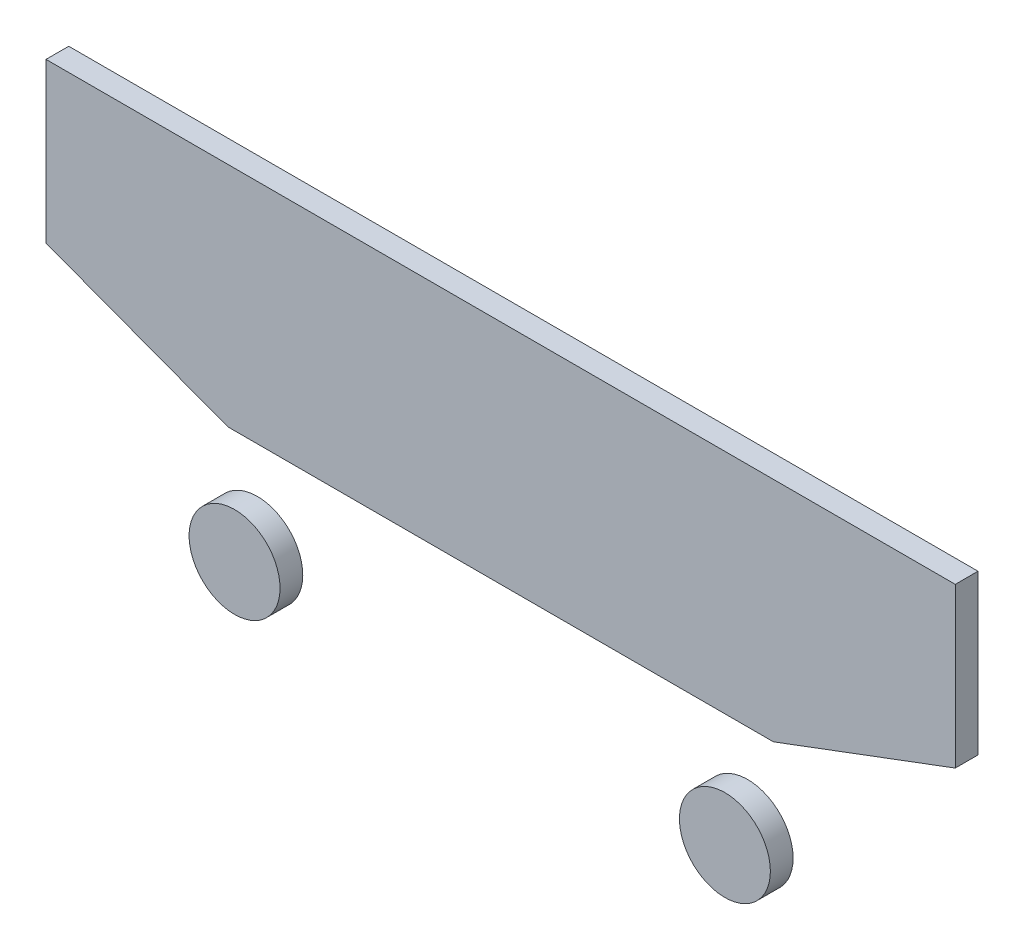
ISO-10303-21;
HEADER;
FILE_DESCRIPTION(('STEP AP214'),'2;1');
FILE_NAME('part.step','',(''),(''),'','','');
FILE_SCHEMA(('AUTOMOTIVE_DESIGN { 1 0 10303 214 1 1 1 1 }'));
ENDSEC;
DATA;
#1=APPLICATION_CONTEXT('core data for automotive mechanical design processes');
#2=APPLICATION_PROTOCOL_DEFINITION('international standard','automotive_design',2000,#1);
#3=PRODUCT_CONTEXT('',#1,'mechanical');
#4=PRODUCT('Part','Part','',(#3));
#5=PRODUCT_RELATED_PRODUCT_CATEGORY('part','',(#4));
#6=PRODUCT_DEFINITION_FORMATION('','',#4);
#7=PRODUCT_DEFINITION_CONTEXT('part definition',#1,'design');
#8=PRODUCT_DEFINITION('design','',#6,#7);
#9=PRODUCT_DEFINITION_SHAPE('','',#8);
#10=(LENGTH_UNIT() NAMED_UNIT(*) SI_UNIT(.MILLI.,.METRE.));
#11=(NAMED_UNIT(*) PLANE_ANGLE_UNIT() SI_UNIT($,.RADIAN.));
#12=(NAMED_UNIT(*) SI_UNIT($,.STERADIAN.) SOLID_ANGLE_UNIT());
#13=UNCERTAINTY_MEASURE_WITH_UNIT(LENGTH_MEASURE(1.E-05),#10,'distance_accuracy_value','');
#14=(GEOMETRIC_REPRESENTATION_CONTEXT(3) GLOBAL_UNCERTAINTY_ASSIGNED_CONTEXT((#13)) GLOBAL_UNIT_ASSIGNED_CONTEXT((#10,
#11,#12)) REPRESENTATION_CONTEXT('',''));
#15=CARTESIAN_POINT('',(0.,0.,0.));
#16=DIRECTION('',(0.,0.,1.));
#17=DIRECTION('',(1.,0.,0.));
#18=AXIS2_PLACEMENT_3D('',#15,#16,#17);
#19=CARTESIAN_POINT('',(107.850406647226,10.,5.));
#20=DIRECTION('',(0.,0.,-1.));
#21=DIRECTION('',(-1.,0.,0.));
#22=AXIS2_PLACEMENT_3D('',#19,#20,#21);
#23=CYLINDRICAL_SURFACE('',#22,9.99999999999998);
#24=CARTESIAN_POINT('',(107.850406647226,10.,5.));
#25=DIRECTION('',(0.,0.,1.));
#26=DIRECTION('',(1.,0.,0.));
#27=AXIS2_PLACEMENT_3D('',#24,#25,#26);
#28=CIRCLE('',#27,9.99999999999998);
#29=CARTESIAN_POINT('',(117.850406647226,10.,5.));
#30=VERTEX_POINT('',#29);
#31=EDGE_CURVE('E52',#30,#30,#28,.T.);
#32=ORIENTED_EDGE('',*,*,#31,.F.);
#33=EDGE_LOOP('',(#32));
#34=FACE_BOUND('',#33,.T.);
#35=CARTESIAN_POINT('',(107.850406647226,10.,0.));
#36=DIRECTION('',(0.,0.,1.));
#37=DIRECTION('',(1.,0.,0.));
#38=AXIS2_PLACEMENT_3D('',#35,#36,#37);
#39=CIRCLE('',#38,9.99999999999998);
#40=CARTESIAN_POINT('',(117.850406647226,10.,0.));
#41=VERTEX_POINT('',#40);
#42=EDGE_CURVE('E11',#41,#41,#39,.T.);
#43=ORIENTED_EDGE('',*,*,#42,.T.);
#44=EDGE_LOOP('',(#43));
#45=FACE_BOUND('',#44,.T.);
#46=ADVANCED_FACE('F48',(#34,#45),#23,.T.);
#47=CARTESIAN_POINT('',(107.850406647226,10.,5.));
#48=DIRECTION('',(0.,0.,1.));
#49=DIRECTION('',(1.,0.,0.));
#50=AXIS2_PLACEMENT_3D('',#47,#48,#49);
#51=PLANE('',#50);
#52=ORIENTED_EDGE('',*,*,#31,.T.);
#53=EDGE_LOOP('',(#52));
#54=FACE_BOUND('',#53,.T.);
#55=ADVANCED_FACE('F50',(#54),#51,.T.);
#56=CARTESIAN_POINT('',(107.850406647226,10.,0.));
#57=DIRECTION('',(0.,0.,1.));
#58=DIRECTION('',(1.,0.,0.));
#59=AXIS2_PLACEMENT_3D('',#56,#57,#58);
#60=PLANE('',#59);
#61=ORIENTED_EDGE('',*,*,#42,.F.);
#62=EDGE_LOOP('',(#61));
#63=FACE_BOUND('',#62,.T.);
#64=ADVANCED_FACE('F67',(#63),#60,.F.);
#65=CLOSED_SHELL('',(#46,#55,#64));
#66=MANIFOLD_SOLID_BREP('B2',#65);
#67=CARTESIAN_POINT('',(0.,10.,5.));
#68=DIRECTION('',(0.,0.,-1.));
#69=DIRECTION('',(-1.,0.,0.));
#70=AXIS2_PLACEMENT_3D('',#67,#68,#69);
#71=CYLINDRICAL_SURFACE('',#70,10.);
#72=CARTESIAN_POINT('',(0.,10.,5.));
#73=DIRECTION('',(0.,0.,1.));
#74=DIRECTION('',(1.,0.,0.));
#75=AXIS2_PLACEMENT_3D('',#72,#73,#74);
#76=CIRCLE('',#75,10.);
#77=CARTESIAN_POINT('',(10.,10.,5.));
#78=VERTEX_POINT('',#77);
#79=EDGE_CURVE('E102',#78,#78,#76,.T.);
#80=ORIENTED_EDGE('',*,*,#79,.F.);
#81=EDGE_LOOP('',(#80));
#82=FACE_BOUND('',#81,.T.);
#83=CARTESIAN_POINT('',(0.,10.,0.));
#84=DIRECTION('',(0.,0.,1.));
#85=DIRECTION('',(1.,0.,0.));
#86=AXIS2_PLACEMENT_3D('',#83,#84,#85);
#87=CIRCLE('',#86,10.);
#88=CARTESIAN_POINT('',(10.,10.,0.));
#89=VERTEX_POINT('',#88);
#90=EDGE_CURVE('E47',#89,#89,#87,.T.);
#91=ORIENTED_EDGE('',*,*,#90,.T.);
#92=EDGE_LOOP('',(#91));
#93=FACE_BOUND('',#92,.T.);
#94=ADVANCED_FACE('F98',(#82,#93),#71,.T.);
#95=CARTESIAN_POINT('',(0.,10.,5.));
#96=DIRECTION('',(0.,0.,1.));
#97=DIRECTION('',(1.,0.,0.));
#98=AXIS2_PLACEMENT_3D('',#95,#96,#97);
#99=PLANE('',#98);
#100=ORIENTED_EDGE('',*,*,#79,.T.);
#101=EDGE_LOOP('',(#100));
#102=FACE_BOUND('',#101,.T.);
#103=ADVANCED_FACE('F100',(#102),#99,.T.);
#104=CARTESIAN_POINT('',(0.,10.,0.));
#105=DIRECTION('',(0.,0.,1.));
#106=DIRECTION('',(1.,0.,0.));
#107=AXIS2_PLACEMENT_3D('',#104,#105,#106);
#108=PLANE('',#107);
#109=ORIENTED_EDGE('',*,*,#90,.F.);
#110=EDGE_LOOP('',(#109));
#111=FACE_BOUND('',#110,.T.);
#112=ADVANCED_FACE('F117',(#111),#108,.F.);
#113=CLOSED_SHELL('',(#94,#103,#112));
#114=MANIFOLD_SOLID_BREP('B6',#113);
#115=CARTESIAN_POINT('',(-41.4773846569735,50.,5.));
#116=DIRECTION('',(0.351123441588392,0.936329177569045,0.));
#117=DIRECTION('',(-0.936329177569045,0.351123441588392,0.));
#118=AXIS2_PLACEMENT_3D('',#115,#116,#117);
#119=PLANE('',#118);
#120=DIRECTION('',(0.936329177569045,-0.351123441588392,0.));
#121=VECTOR('',#120,1.);
#122=CARTESIAN_POINT('',(-41.4773846569735,50.,0.));
#123=LINE('',#122,#121);
#124=CARTESIAN_POINT('',(-41.4773846569735,50.,0.));
#125=VERTEX_POINT('',#124);
#126=CARTESIAN_POINT('',(-1.47738465697353,35.,0.));
#127=VERTEX_POINT('',#126);
#128=EDGE_CURVE('E223',#125,#127,#123,.T.);
#129=ORIENTED_EDGE('',*,*,#128,.T.);
#130=DIRECTION('',(0.,0.,-1.));
#131=VECTOR('',#130,1.);
#132=CARTESIAN_POINT('',(-1.47738465697353,35.,5.));
#133=LINE('',#132,#131);
#134=CARTESIAN_POINT('',(-1.47738465697353,35.,5.));
#135=VERTEX_POINT('',#134);
#136=EDGE_CURVE('E96',#135,#127,#133,.T.);
#137=ORIENTED_EDGE('',*,*,#136,.F.);
#138=DIRECTION('',(0.936329177569045,-0.351123441588392,0.));
#139=VECTOR('',#138,1.);
#140=CARTESIAN_POINT('',(-41.4773846569735,50.,5.));
#141=LINE('',#140,#139);
#142=CARTESIAN_POINT('',(-41.4773846569735,50.,5.));
#143=VERTEX_POINT('',#142);
#144=EDGE_CURVE('E233',#143,#135,#141,.T.);
#145=ORIENTED_EDGE('',*,*,#144,.F.);
#146=DIRECTION('',(0.,0.,-1.));
#147=VECTOR('',#146,1.);
#148=CARTESIAN_POINT('',(-41.4773846569735,50.,5.));
#149=LINE('',#148,#147);
#150=EDGE_CURVE('E219',#143,#125,#149,.T.);
#151=ORIENTED_EDGE('',*,*,#150,.T.);
#152=EDGE_LOOP('',(#129,#137,#145,#151));
#153=FACE_BOUND('',#152,.T.);
#154=ADVANCED_FACE('F139',(#153),#119,.F.);
#155=CARTESIAN_POINT('',(118.522615343026,35.,5.));
#156=DIRECTION('',(0.,1.,0.));
#157=DIRECTION('',(-1.,0.,0.));
#158=AXIS2_PLACEMENT_3D('',#155,#156,#157);
#159=PLANE('',#158);
#160=DIRECTION('',(1.,0.,0.));
#161=VECTOR('',#160,1.);
#162=CARTESIAN_POINT('',(118.522615343026,35.,0.));
#163=LINE('',#162,#161);
#164=CARTESIAN_POINT('',(118.522615343026,35.,0.));
#165=VERTEX_POINT('',#164);
#166=EDGE_CURVE('E226',#127,#165,#163,.T.);
#167=ORIENTED_EDGE('',*,*,#166,.T.);
#168=DIRECTION('',(0.,0.,-1.));
#169=VECTOR('',#168,1.);
#170=CARTESIAN_POINT('',(118.522615343026,35.,5.));
#171=LINE('',#170,#169);
#172=CARTESIAN_POINT('',(118.522615343026,35.,5.));
#173=VERTEX_POINT('',#172);
#174=EDGE_CURVE('E147',#173,#165,#171,.T.);
#175=ORIENTED_EDGE('',*,*,#174,.F.);
#176=DIRECTION('',(1.,0.,0.));
#177=VECTOR('',#176,1.);
#178=CARTESIAN_POINT('',(118.522615343026,35.,5.));
#179=LINE('',#178,#177);
#180=EDGE_CURVE('E192',#135,#173,#179,.T.);
#181=ORIENTED_EDGE('',*,*,#180,.F.);
#182=ORIENTED_EDGE('',*,*,#136,.T.);
#183=EDGE_LOOP('',(#167,#175,#181,#182));
#184=FACE_BOUND('',#183,.T.);
#185=ADVANCED_FACE('F257',(#184),#159,.F.);
#186=CARTESIAN_POINT('',(118.522615343026,35.,5.));
#187=DIRECTION('',(-0.351123441588392,0.936329177569045,0.));
#188=DIRECTION('',(-0.936329177569045,-0.351123441588392,0.));
#189=AXIS2_PLACEMENT_3D('',#186,#187,#188);
#190=PLANE('',#189);
#191=DIRECTION('',(0.936329177569045,0.351123441588392,0.));
#192=VECTOR('',#191,1.);
#193=CARTESIAN_POINT('',(118.522615343026,35.,0.));
#194=LINE('',#193,#192);
#195=CARTESIAN_POINT('',(158.522615343026,50.,0.));
#196=VERTEX_POINT('',#195);
#197=EDGE_CURVE('E228',#165,#196,#194,.T.);
#198=ORIENTED_EDGE('',*,*,#197,.T.);
#199=DIRECTION('',(0.,0.,-1.));
#200=VECTOR('',#199,1.);
#201=CARTESIAN_POINT('',(158.522615343026,50.,5.));
#202=LINE('',#201,#200);
#203=CARTESIAN_POINT('',(158.522615343026,50.,5.));
#204=VERTEX_POINT('',#203);
#205=EDGE_CURVE('E214',#204,#196,#202,.T.);
#206=ORIENTED_EDGE('',*,*,#205,.F.);
#207=DIRECTION('',(0.936329177569045,0.351123441588392,0.));
#208=VECTOR('',#207,1.);
#209=CARTESIAN_POINT('',(118.522615343026,35.,5.));
#210=LINE('',#209,#208);
#211=EDGE_CURVE('E205',#173,#204,#210,.T.);
#212=ORIENTED_EDGE('',*,*,#211,.F.);
#213=ORIENTED_EDGE('',*,*,#174,.T.);
#214=EDGE_LOOP('',(#198,#206,#212,#213));
#215=FACE_BOUND('',#214,.T.);
#216=ADVANCED_FACE('F239',(#215),#190,.F.);
#217=CARTESIAN_POINT('',(158.522615343026,50.,5.));
#218=DIRECTION('',(-1.,0.,0.));
#219=DIRECTION('',(0.,0.,1.));
#220=AXIS2_PLACEMENT_3D('',#217,#218,#219);
#221=PLANE('',#220);
#222=DIRECTION('',(0.,1.,0.));
#223=VECTOR('',#222,1.);
#224=CARTESIAN_POINT('',(158.522615343026,50.,0.));
#225=LINE('',#224,#223);
#226=CARTESIAN_POINT('',(158.522615343026,85.,0.));
#227=VERTEX_POINT('',#226);
#228=EDGE_CURVE('E213',#196,#227,#225,.T.);
#229=ORIENTED_EDGE('',*,*,#228,.T.);
#230=DIRECTION('',(0.,0.,-1.));
#231=VECTOR('',#230,1.);
#232=CARTESIAN_POINT('',(158.522615343026,85.,5.));
#233=LINE('',#232,#231);
#234=CARTESIAN_POINT('',(158.522615343026,85.,5.));
#235=VERTEX_POINT('',#234);
#236=EDGE_CURVE('E210',#235,#227,#233,.T.);
#237=ORIENTED_EDGE('',*,*,#236,.F.);
#238=DIRECTION('',(0.,1.,0.));
#239=VECTOR('',#238,1.);
#240=CARTESIAN_POINT('',(158.522615343026,50.,5.));
#241=LINE('',#240,#239);
#242=EDGE_CURVE('E199',#204,#235,#241,.T.);
#243=ORIENTED_EDGE('',*,*,#242,.F.);
#244=ORIENTED_EDGE('',*,*,#205,.T.);
#245=EDGE_LOOP('',(#229,#237,#243,#244));
#246=FACE_BOUND('',#245,.T.);
#247=ADVANCED_FACE('F211',(#246),#221,.F.);
#248=CARTESIAN_POINT('',(158.522615343026,85.,5.));
#249=DIRECTION('',(0.,-1.,0.));
#250=DIRECTION('',(0.,0.,-1.));
#251=AXIS2_PLACEMENT_3D('',#248,#249,#250);
#252=PLANE('',#251);
#253=DIRECTION('',(-1.,0.,0.));
#254=VECTOR('',#253,1.);
#255=CARTESIAN_POINT('',(158.522615343026,85.,0.));
#256=LINE('',#255,#254);
#257=CARTESIAN_POINT('',(-41.4773846569735,85.,0.));
#258=VERTEX_POINT('',#257);
#259=EDGE_CURVE('E178',#227,#258,#256,.T.);
#260=ORIENTED_EDGE('',*,*,#259,.T.);
#261=DIRECTION('',(0.,0.,-1.));
#262=VECTOR('',#261,1.);
#263=CARTESIAN_POINT('',(-41.4773846569735,85.,5.));
#264=LINE('',#263,#262);
#265=CARTESIAN_POINT('',(-41.4773846569735,85.,5.));
#266=VERTEX_POINT('',#265);
#267=EDGE_CURVE('E215',#266,#258,#264,.T.);
#268=ORIENTED_EDGE('',*,*,#267,.F.);
#269=DIRECTION('',(-1.,0.,0.));
#270=VECTOR('',#269,1.);
#271=CARTESIAN_POINT('',(158.522615343026,85.,5.));
#272=LINE('',#271,#270);
#273=EDGE_CURVE('E203',#235,#266,#272,.T.);
#274=ORIENTED_EDGE('',*,*,#273,.F.);
#275=ORIENTED_EDGE('',*,*,#236,.T.);
#276=EDGE_LOOP('',(#260,#268,#274,#275));
#277=FACE_BOUND('',#276,.T.);
#278=ADVANCED_FACE('F217',(#277),#252,.F.);
#279=CARTESIAN_POINT('',(-41.4773846569735,85.,5.));
#280=DIRECTION('',(1.,0.,0.));
#281=DIRECTION('',(0.,1.,0.));
#282=AXIS2_PLACEMENT_3D('',#279,#280,#281);
#283=PLANE('',#282);
#284=DIRECTION('',(0.,-1.,0.));
#285=VECTOR('',#284,1.);
#286=CARTESIAN_POINT('',(-41.4773846569735,85.,0.));
#287=LINE('',#286,#285);
#288=EDGE_CURVE('E184',#258,#125,#287,.T.);
#289=ORIENTED_EDGE('',*,*,#288,.T.);
#290=ORIENTED_EDGE('',*,*,#150,.F.);
#291=DIRECTION('',(0.,-1.,0.));
#292=VECTOR('',#291,1.);
#293=CARTESIAN_POINT('',(-41.4773846569735,85.,5.));
#294=LINE('',#293,#292);
#295=EDGE_CURVE('E155',#266,#143,#294,.T.);
#296=ORIENTED_EDGE('',*,*,#295,.F.);
#297=ORIENTED_EDGE('',*,*,#267,.T.);
#298=EDGE_LOOP('',(#289,#290,#296,#297));
#299=FACE_BOUND('',#298,.T.);
#300=ADVANCED_FACE('F246',(#299),#283,.F.);
#301=CARTESIAN_POINT('',(0.,0.,5.));
#302=DIRECTION('',(0.,0.,1.));
#303=DIRECTION('',(1.,0.,0.));
#304=AXIS2_PLACEMENT_3D('',#301,#302,#303);
#305=PLANE('',#304);
#306=ORIENTED_EDGE('',*,*,#144,.T.);
#307=ORIENTED_EDGE('',*,*,#180,.T.);
#308=ORIENTED_EDGE('',*,*,#211,.T.);
#309=ORIENTED_EDGE('',*,*,#242,.T.);
#310=ORIENTED_EDGE('',*,*,#273,.T.);
#311=ORIENTED_EDGE('',*,*,#295,.T.);
#312=EDGE_LOOP('',(#306,#307,#308,#309,#310,#311));
#313=FACE_BOUND('',#312,.T.);
#314=ADVANCED_FACE('F201',(#313),#305,.T.);
#315=CARTESIAN_POINT('',(0.,0.,0.));
#316=DIRECTION('',(0.,0.,1.));
#317=DIRECTION('',(1.,0.,0.));
#318=AXIS2_PLACEMENT_3D('',#315,#316,#317);
#319=PLANE('',#318);
#320=ORIENTED_EDGE('',*,*,#128,.F.);
#321=ORIENTED_EDGE('',*,*,#288,.F.);
#322=ORIENTED_EDGE('',*,*,#259,.F.);
#323=ORIENTED_EDGE('',*,*,#228,.F.);
#324=ORIENTED_EDGE('',*,*,#197,.F.);
#325=ORIENTED_EDGE('',*,*,#166,.F.);
#326=EDGE_LOOP('',(#320,#321,#322,#323,#324,#325));
#327=FACE_BOUND('',#326,.T.);
#328=ADVANCED_FACE('F242',(#327),#319,.F.);
#329=CLOSED_SHELL('',(#154,#185,#216,#247,#278,#300,#314,#328));
#330=MANIFOLD_SOLID_BREP('B42',#329);
#331=ADVANCED_BREP_SHAPE_REPRESENTATION('',(#18,#66,#114,#330),#14);
#332=SHAPE_DEFINITION_REPRESENTATION(#9,#331);
ENDSEC;
END-ISO-10303-21;
